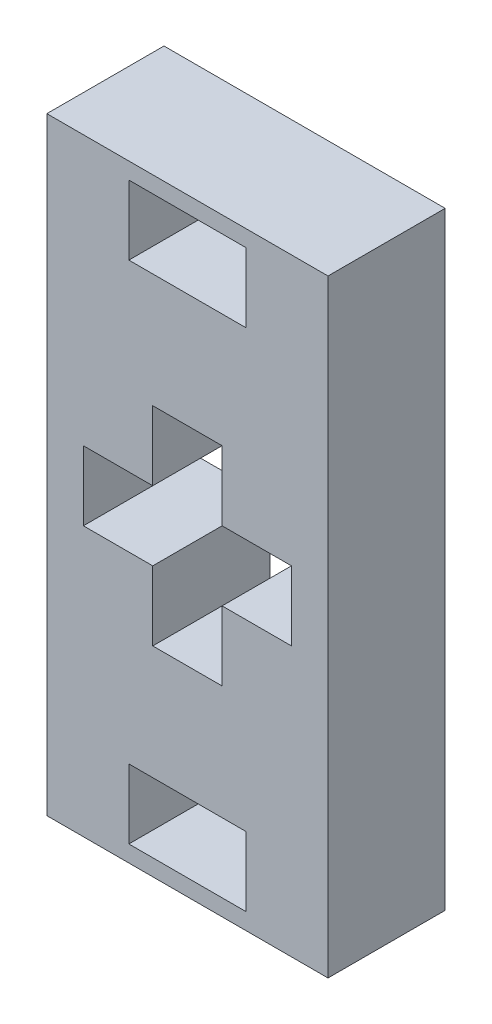
ISO-10303-21;
HEADER;
FILE_DESCRIPTION(('STEP AP214'),'2;1');
FILE_NAME('part.step','',(''),(''),'','','');
FILE_SCHEMA(('AUTOMOTIVE_DESIGN { 1 0 10303 214 1 1 1 1 }'));
ENDSEC;
DATA;
#1=APPLICATION_CONTEXT('core data for automotive mechanical design processes');
#2=APPLICATION_PROTOCOL_DEFINITION('international standard','automotive_design',2000,#1);
#3=PRODUCT_CONTEXT('',#1,'mechanical');
#4=PRODUCT('Part','Part','',(#3));
#5=PRODUCT_RELATED_PRODUCT_CATEGORY('part','',(#4));
#6=PRODUCT_DEFINITION_FORMATION('','',#4);
#7=PRODUCT_DEFINITION_CONTEXT('part definition',#1,'design');
#8=PRODUCT_DEFINITION('design','',#6,#7);
#9=PRODUCT_DEFINITION_SHAPE('','',#8);
#10=(LENGTH_UNIT() NAMED_UNIT(*) SI_UNIT(.MILLI.,.METRE.));
#11=(NAMED_UNIT(*) PLANE_ANGLE_UNIT() SI_UNIT($,.RADIAN.));
#12=(NAMED_UNIT(*) SI_UNIT($,.STERADIAN.) SOLID_ANGLE_UNIT());
#13=UNCERTAINTY_MEASURE_WITH_UNIT(LENGTH_MEASURE(1.E-05),#10,'distance_accuracy_value','');
#14=(GEOMETRIC_REPRESENTATION_CONTEXT(3) GLOBAL_UNCERTAINTY_ASSIGNED_CONTEXT((#13)) GLOBAL_UNIT_ASSIGNED_CONTEXT((#10,
#11,#12)) REPRESENTATION_CONTEXT('',''));
#15=CARTESIAN_POINT('',(0.,0.,0.));
#16=DIRECTION('',(0.,0.,1.));
#17=DIRECTION('',(1.,0.,0.));
#18=AXIS2_PLACEMENT_3D('',#15,#16,#17);
#19=CARTESIAN_POINT('',(0.,16.47698,3.175));
#20=DIRECTION('',(1.,0.,0.));
#21=DIRECTION('',(0.,1.,0.));
#22=AXIS2_PLACEMENT_3D('',#19,#20,#21);
#23=PLANE('',#22);
#24=DIRECTION('',(0.,-1.,0.));
#25=VECTOR('',#24,1.);
#26=CARTESIAN_POINT('',(0.,16.47698,0.));
#27=LINE('',#26,#25);
#28=CARTESIAN_POINT('',(0.,16.47698,0.));
#29=VERTEX_POINT('',#28);
#30=CARTESIAN_POINT('',(0.,0.,0.));
#31=VERTEX_POINT('',#30);
#32=EDGE_CURVE('E341',#29,#31,#27,.T.);
#33=ORIENTED_EDGE('',*,*,#32,.T.);
#34=DIRECTION('',(0.,0.,-1.));
#35=VECTOR('',#34,1.);
#36=CARTESIAN_POINT('',(0.,0.,3.175));
#37=LINE('',#36,#35);
#38=CARTESIAN_POINT('',(0.,0.,3.175));
#39=VERTEX_POINT('',#38);
#40=EDGE_CURVE('E11',#39,#31,#37,.T.);
#41=ORIENTED_EDGE('',*,*,#40,.F.);
#42=DIRECTION('',(0.,-1.,0.));
#43=VECTOR('',#42,1.);
#44=CARTESIAN_POINT('',(0.,16.47698,3.175));
#45=LINE('',#44,#43);
#46=CARTESIAN_POINT('',(0.,16.47698,3.175));
#47=VERTEX_POINT('',#46);
#48=EDGE_CURVE('E342',#47,#39,#45,.T.);
#49=ORIENTED_EDGE('',*,*,#48,.F.);
#50=DIRECTION('',(0.,0.,-1.));
#51=VECTOR('',#50,1.);
#52=CARTESIAN_POINT('',(0.,16.47698,3.175));
#53=LINE('',#52,#51);
#54=EDGE_CURVE('E352',#47,#29,#53,.T.);
#55=ORIENTED_EDGE('',*,*,#54,.T.);
#56=EDGE_LOOP('',(#33,#41,#49,#55));
#57=FACE_BOUND('',#56,.T.);
#58=ADVANCED_FACE('F34',(#57),#23,.F.);
#59=CARTESIAN_POINT('',(0.,0.,3.175));
#60=DIRECTION('',(0.,1.,0.));
#61=DIRECTION('',(-1.,0.,0.));
#62=AXIS2_PLACEMENT_3D('',#59,#60,#61);
#63=PLANE('',#62);
#64=DIRECTION('',(1.,0.,0.));
#65=VECTOR('',#64,1.);
#66=CARTESIAN_POINT('',(0.,0.,0.));
#67=LINE('',#66,#65);
#68=CARTESIAN_POINT('',(7.62,0.,0.));
#69=VERTEX_POINT('',#68);
#70=EDGE_CURVE('E356',#31,#69,#67,.T.);
#71=ORIENTED_EDGE('',*,*,#70,.T.);
#72=DIRECTION('',(0.,0.,-1.));
#73=VECTOR('',#72,1.);
#74=CARTESIAN_POINT('',(7.62,0.,3.175));
#75=LINE('',#74,#73);
#76=CARTESIAN_POINT('',(7.62,0.,3.175));
#77=VERTEX_POINT('',#76);
#78=EDGE_CURVE('E41',#77,#69,#75,.T.);
#79=ORIENTED_EDGE('',*,*,#78,.F.);
#80=DIRECTION('',(1.,0.,0.));
#81=VECTOR('',#80,1.);
#82=CARTESIAN_POINT('',(0.,0.,3.175));
#83=LINE('',#82,#81);
#84=EDGE_CURVE('E345',#39,#77,#83,.T.);
#85=ORIENTED_EDGE('',*,*,#84,.F.);
#86=ORIENTED_EDGE('',*,*,#40,.T.);
#87=EDGE_LOOP('',(#71,#79,#85,#86));
#88=FACE_BOUND('',#87,.T.);
#89=ADVANCED_FACE('F385',(#88),#63,.F.);
#90=CARTESIAN_POINT('',(7.62,16.47698,3.175));
#91=DIRECTION('',(-1.,0.,0.));
#92=DIRECTION('',(0.,-1.,0.));
#93=AXIS2_PLACEMENT_3D('',#90,#91,#92);
#94=PLANE('',#93);
#95=DIRECTION('',(0.,1.,0.));
#96=VECTOR('',#95,1.);
#97=CARTESIAN_POINT('',(7.62,16.47698,0.));
#98=LINE('',#97,#96);
#99=CARTESIAN_POINT('',(7.62,16.47698,0.));
#100=VERTEX_POINT('',#99);
#101=EDGE_CURVE('E358',#69,#100,#98,.T.);
#102=ORIENTED_EDGE('',*,*,#101,.T.);
#103=DIRECTION('',(0.,0.,-1.));
#104=VECTOR('',#103,1.);
#105=CARTESIAN_POINT('',(7.62,16.47698,3.175));
#106=LINE('',#105,#104);
#107=CARTESIAN_POINT('',(7.62,16.47698,3.175));
#108=VERTEX_POINT('',#107);
#109=EDGE_CURVE('E363',#108,#100,#106,.T.);
#110=ORIENTED_EDGE('',*,*,#109,.F.);
#111=DIRECTION('',(0.,1.,0.));
#112=VECTOR('',#111,1.);
#113=CARTESIAN_POINT('',(7.62,16.47698,3.175));
#114=LINE('',#113,#112);
#115=EDGE_CURVE('E348',#77,#108,#114,.T.);
#116=ORIENTED_EDGE('',*,*,#115,.F.);
#117=ORIENTED_EDGE('',*,*,#78,.T.);
#118=EDGE_LOOP('',(#102,#110,#116,#117));
#119=FACE_BOUND('',#118,.T.);
#120=ADVANCED_FACE('F370',(#119),#94,.F.);
#121=CARTESIAN_POINT('',(0.,16.47698,3.175));
#122=DIRECTION('',(0.,-1.,0.));
#123=DIRECTION('',(1.,0.,0.));
#124=AXIS2_PLACEMENT_3D('',#121,#122,#123);
#125=PLANE('',#124);
#126=DIRECTION('',(-1.,0.,0.));
#127=VECTOR('',#126,1.);
#128=CARTESIAN_POINT('',(0.,16.47698,0.));
#129=LINE('',#128,#127);
#130=EDGE_CURVE('E346',#100,#29,#129,.T.);
#131=ORIENTED_EDGE('',*,*,#130,.T.);
#132=ORIENTED_EDGE('',*,*,#54,.F.);
#133=DIRECTION('',(-1.,0.,0.));
#134=VECTOR('',#133,1.);
#135=CARTESIAN_POINT('',(0.,16.47698,3.175));
#136=LINE('',#135,#134);
#137=EDGE_CURVE('E350',#108,#47,#136,.T.);
#138=ORIENTED_EDGE('',*,*,#137,.F.);
#139=ORIENTED_EDGE('',*,*,#109,.T.);
#140=EDGE_LOOP('',(#131,#132,#138,#139));
#141=FACE_BOUND('',#140,.T.);
#142=ADVANCED_FACE('F379',(#141),#125,.F.);
#143=CARTESIAN_POINT('',(0.,0.,3.175));
#144=DIRECTION('',(0.,0.,1.));
#145=DIRECTION('',(1.,0.,0.));
#146=AXIS2_PLACEMENT_3D('',#143,#144,#145);
#147=PLANE('',#146);
#148=DIRECTION('',(-1.,0.,0.));
#149=VECTOR('',#148,1.);
#150=CARTESIAN_POINT('',(2.2225,16.0300688226069,3.175));
#151=LINE('',#150,#149);
#152=CARTESIAN_POINT('',(5.3975,16.0300688226069,3.175));
#153=VERTEX_POINT('',#152);
#154=CARTESIAN_POINT('',(2.2225,16.0300688226069,3.175));
#155=VERTEX_POINT('',#154);
#156=EDGE_CURVE('E48',#153,#155,#151,.T.);
#157=ORIENTED_EDGE('',*,*,#156,.F.);
#158=DIRECTION('',(0.,1.,0.));
#159=VECTOR('',#158,1.);
#160=CARTESIAN_POINT('',(5.3975,16.0300688226069,3.175));
#161=LINE('',#160,#159);
#162=CARTESIAN_POINT('',(5.3975,14.1504688226069,3.175));
#163=VERTEX_POINT('',#162);
#164=EDGE_CURVE('E213',#163,#153,#161,.T.);
#165=ORIENTED_EDGE('',*,*,#164,.F.);
#166=DIRECTION('',(1.,0.,0.));
#167=VECTOR('',#166,1.);
#168=CARTESIAN_POINT('',(2.2225,14.1504688226069,3.175));
#169=LINE('',#168,#167);
#170=CARTESIAN_POINT('',(2.2225,14.1504688226069,3.175));
#171=VERTEX_POINT('',#170);
#172=EDGE_CURVE('E197',#171,#163,#169,.T.);
#173=ORIENTED_EDGE('',*,*,#172,.F.);
#174=DIRECTION('',(0.,-1.,0.));
#175=VECTOR('',#174,1.);
#176=CARTESIAN_POINT('',(2.2225,16.0300688226069,3.175));
#177=LINE('',#176,#175);
#178=EDGE_CURVE('E206',#155,#171,#177,.T.);
#179=ORIENTED_EDGE('',*,*,#178,.F.);
#180=EDGE_LOOP('',(#157,#165,#173,#179));
#181=FACE_BOUND('',#180,.T.);
#182=DIRECTION('',(-1.,0.,0.));
#183=VECTOR('',#182,1.);
#184=CARTESIAN_POINT('',(2.2225,2.32676882260687,3.175));
#185=LINE('',#184,#183);
#186=CARTESIAN_POINT('',(5.3975,2.32676882260687,3.175));
#187=VERTEX_POINT('',#186);
#188=CARTESIAN_POINT('',(2.2225,2.32676882260687,3.175));
#189=VERTEX_POINT('',#188);
#190=EDGE_CURVE('E224',#187,#189,#185,.T.);
#191=ORIENTED_EDGE('',*,*,#190,.F.);
#192=DIRECTION('',(0.,1.,0.));
#193=VECTOR('',#192,1.);
#194=CARTESIAN_POINT('',(5.3975,2.32676882260687,3.175));
#195=LINE('',#194,#193);
#196=CARTESIAN_POINT('',(5.3975,0.44716882260687,3.175));
#197=VERTEX_POINT('',#196);
#198=EDGE_CURVE('E242',#197,#187,#195,.T.);
#199=ORIENTED_EDGE('',*,*,#198,.F.);
#200=DIRECTION('',(1.,0.,0.));
#201=VECTOR('',#200,1.);
#202=CARTESIAN_POINT('',(2.2225,0.447168822606869,3.175));
#203=LINE('',#202,#201);
#204=CARTESIAN_POINT('',(2.2225,0.447168822606869,3.175));
#205=VERTEX_POINT('',#204);
#206=EDGE_CURVE('E239',#205,#197,#203,.T.);
#207=ORIENTED_EDGE('',*,*,#206,.F.);
#208=DIRECTION('',(0.,-1.,0.));
#209=VECTOR('',#208,1.);
#210=CARTESIAN_POINT('',(2.2225,2.32676882260687,3.175));
#211=LINE('',#210,#209);
#212=EDGE_CURVE('E236',#189,#205,#211,.T.);
#213=ORIENTED_EDGE('',*,*,#212,.F.);
#214=EDGE_LOOP('',(#191,#199,#207,#213));
#215=FACE_BOUND('',#214,.T.);
#216=DIRECTION('',(0.,1.,0.));
#217=VECTOR('',#216,1.);
#218=CARTESIAN_POINT('',(4.7498,11.05789,3.175));
#219=LINE('',#218,#217);
#220=CARTESIAN_POINT('',(4.7498,9.17829,3.175));
#221=VERTEX_POINT('',#220);
#222=CARTESIAN_POINT('',(4.7498,11.05789,3.175));
#223=VERTEX_POINT('',#222);
#224=EDGE_CURVE('E254',#221,#223,#219,.T.);
#225=ORIENTED_EDGE('',*,*,#224,.F.);
#226=DIRECTION('',(-1.,0.,0.));
#227=VECTOR('',#226,1.);
#228=CARTESIAN_POINT('',(4.7498,9.17829,3.175));
#229=LINE('',#228,#227);
#230=CARTESIAN_POINT('',(6.6294,9.17829,3.175));
#231=VERTEX_POINT('',#230);
#232=EDGE_CURVE('E313',#231,#221,#229,.T.);
#233=ORIENTED_EDGE('',*,*,#232,.F.);
#234=DIRECTION('',(0.,1.,0.));
#235=VECTOR('',#234,1.);
#236=CARTESIAN_POINT('',(6.6294,9.17829,3.175));
#237=LINE('',#236,#235);
#238=CARTESIAN_POINT('',(6.6294,7.29869,3.175));
#239=VERTEX_POINT('',#238);
#240=EDGE_CURVE('E310',#239,#231,#237,.T.);
#241=ORIENTED_EDGE('',*,*,#240,.F.);
#242=DIRECTION('',(1.,0.,0.));
#243=VECTOR('',#242,1.);
#244=CARTESIAN_POINT('',(6.6294,7.29869,3.175));
#245=LINE('',#244,#243);
#246=CARTESIAN_POINT('',(4.7498,7.29869,3.175));
#247=VERTEX_POINT('',#246);
#248=EDGE_CURVE('E307',#247,#239,#245,.T.);
#249=ORIENTED_EDGE('',*,*,#248,.F.);
#250=DIRECTION('',(0.,1.,0.));
#251=VECTOR('',#250,1.);
#252=CARTESIAN_POINT('',(4.7498,7.29869,3.175));
#253=LINE('',#252,#251);
#254=CARTESIAN_POINT('',(4.7498,5.41909,3.175));
#255=VERTEX_POINT('',#254);
#256=EDGE_CURVE('E304',#255,#247,#253,.T.);
#257=ORIENTED_EDGE('',*,*,#256,.F.);
#258=DIRECTION('',(1.,0.,0.));
#259=VECTOR('',#258,1.);
#260=CARTESIAN_POINT('',(4.7498,5.41909,3.175));
#261=LINE('',#260,#259);
#262=CARTESIAN_POINT('',(2.8702,5.41909,3.175));
#263=VERTEX_POINT('',#262);
#264=EDGE_CURVE('E301',#263,#255,#261,.T.);
#265=ORIENTED_EDGE('',*,*,#264,.F.);
#266=DIRECTION('',(0.,-1.,0.));
#267=VECTOR('',#266,1.);
#268=CARTESIAN_POINT('',(2.8702,5.41909,3.175));
#269=LINE('',#268,#267);
#270=CARTESIAN_POINT('',(2.8702,7.29869,3.175));
#271=VERTEX_POINT('',#270);
#272=EDGE_CURVE('E298',#271,#263,#269,.T.);
#273=ORIENTED_EDGE('',*,*,#272,.F.);
#274=DIRECTION('',(1.,0.,0.));
#275=VECTOR('',#274,1.);
#276=CARTESIAN_POINT('',(0.990600000000005,7.29869,3.175));
#277=LINE('',#276,#275);
#278=CARTESIAN_POINT('',(0.990600000000005,7.29869,3.175));
#279=VERTEX_POINT('',#278);
#280=EDGE_CURVE('E295',#279,#271,#277,.T.);
#281=ORIENTED_EDGE('',*,*,#280,.F.);
#282=DIRECTION('',(0.,-1.,0.));
#283=VECTOR('',#282,1.);
#284=CARTESIAN_POINT('',(0.990600000000005,7.29869,3.175));
#285=LINE('',#284,#283);
#286=CARTESIAN_POINT('',(0.990600000000005,9.17829,3.175));
#287=VERTEX_POINT('',#286);
#288=EDGE_CURVE('E292',#287,#279,#285,.T.);
#289=ORIENTED_EDGE('',*,*,#288,.F.);
#290=DIRECTION('',(-1.,0.,0.));
#291=VECTOR('',#290,1.);
#292=CARTESIAN_POINT('',(2.8702,9.17829,3.175));
#293=LINE('',#292,#291);
#294=CARTESIAN_POINT('',(2.8702,9.17829,3.175));
#295=VERTEX_POINT('',#294);
#296=EDGE_CURVE('E289',#295,#287,#293,.T.);
#297=ORIENTED_EDGE('',*,*,#296,.F.);
#298=DIRECTION('',(0.,-1.,0.));
#299=VECTOR('',#298,1.);
#300=CARTESIAN_POINT('',(2.8702,9.17829,3.175));
#301=LINE('',#300,#299);
#302=CARTESIAN_POINT('',(2.8702,11.05789,3.175));
#303=VERTEX_POINT('',#302);
#304=EDGE_CURVE('E286',#303,#295,#301,.T.);
#305=ORIENTED_EDGE('',*,*,#304,.F.);
#306=DIRECTION('',(-1.,0.,0.));
#307=VECTOR('',#306,1.);
#308=CARTESIAN_POINT('',(2.8702,11.05789,3.175));
#309=LINE('',#308,#307);
#310=EDGE_CURVE('E283',#223,#303,#309,.T.);
#311=ORIENTED_EDGE('',*,*,#310,.F.);
#312=EDGE_LOOP('',(#225,#233,#241,#249,#257,#265,#273,#281,#289,#297,#305,#311));
#313=FACE_BOUND('',#312,.T.);
#314=ORIENTED_EDGE('',*,*,#48,.T.);
#315=ORIENTED_EDGE('',*,*,#84,.T.);
#316=ORIENTED_EDGE('',*,*,#115,.T.);
#317=ORIENTED_EDGE('',*,*,#137,.T.);
#318=EDGE_LOOP('',(#314,#315,#316,#317));
#319=FACE_BOUND('',#318,.T.);
#320=ADVANCED_FACE('F210',(#181,#215,#313,#319),#147,.T.);
#321=CARTESIAN_POINT('',(0.,0.,0.));
#322=DIRECTION('',(0.,0.,1.));
#323=DIRECTION('',(1.,0.,0.));
#324=AXIS2_PLACEMENT_3D('',#321,#322,#323);
#325=PLANE('',#324);
#326=DIRECTION('',(0.,-1.,0.));
#327=VECTOR('',#326,1.);
#328=CARTESIAN_POINT('',(5.3975,16.0300688226069,0.));
#329=LINE('',#328,#327);
#330=CARTESIAN_POINT('',(5.3975,16.0300688226069,0.));
#331=VERTEX_POINT('',#330);
#332=CARTESIAN_POINT('',(5.3975,14.1504688226069,0.));
#333=VERTEX_POINT('',#332);
#334=EDGE_CURVE('E478',#331,#333,#329,.T.);
#335=ORIENTED_EDGE('',*,*,#334,.F.);
#336=DIRECTION('',(1.,0.,0.));
#337=VECTOR('',#336,1.);
#338=CARTESIAN_POINT('',(2.2225,16.0300688226069,0.));
#339=LINE('',#338,#337);
#340=CARTESIAN_POINT('',(2.2225,16.0300688226069,0.));
#341=VERTEX_POINT('',#340);
#342=EDGE_CURVE('E225',#341,#331,#339,.T.);
#343=ORIENTED_EDGE('',*,*,#342,.F.);
#344=DIRECTION('',(0.,1.,0.));
#345=VECTOR('',#344,1.);
#346=CARTESIAN_POINT('',(2.2225,16.0300688226069,0.));
#347=LINE('',#346,#345);
#348=CARTESIAN_POINT('',(2.2225,14.1504688226069,0.));
#349=VERTEX_POINT('',#348);
#350=EDGE_CURVE('E222',#349,#341,#347,.T.);
#351=ORIENTED_EDGE('',*,*,#350,.F.);
#352=DIRECTION('',(-1.,0.,0.));
#353=VECTOR('',#352,1.);
#354=CARTESIAN_POINT('',(2.2225,14.1504688226069,0.));
#355=LINE('',#354,#353);
#356=EDGE_CURVE('E200',#333,#349,#355,.T.);
#357=ORIENTED_EDGE('',*,*,#356,.F.);
#358=EDGE_LOOP('',(#335,#343,#351,#357));
#359=FACE_BOUND('',#358,.T.);
#360=DIRECTION('',(0.,-1.,0.));
#361=VECTOR('',#360,1.);
#362=CARTESIAN_POINT('',(5.3975,2.32676882260687,0.));
#363=LINE('',#362,#361);
#364=CARTESIAN_POINT('',(5.3975,2.32676882260687,0.));
#365=VERTEX_POINT('',#364);
#366=CARTESIAN_POINT('',(5.3975,0.44716882260687,0.));
#367=VERTEX_POINT('',#366);
#368=EDGE_CURVE('E229',#365,#367,#363,.T.);
#369=ORIENTED_EDGE('',*,*,#368,.F.);
#370=DIRECTION('',(1.,0.,0.));
#371=VECTOR('',#370,1.);
#372=CARTESIAN_POINT('',(2.2225,2.32676882260687,0.));
#373=LINE('',#372,#371);
#374=CARTESIAN_POINT('',(2.2225,2.32676882260687,0.));
#375=VERTEX_POINT('',#374);
#376=EDGE_CURVE('E232',#375,#365,#373,.T.);
#377=ORIENTED_EDGE('',*,*,#376,.F.);
#378=DIRECTION('',(0.,1.,0.));
#379=VECTOR('',#378,1.);
#380=CARTESIAN_POINT('',(2.2225,2.32676882260687,0.));
#381=LINE('',#380,#379);
#382=CARTESIAN_POINT('',(2.2225,0.447168822606869,0.));
#383=VERTEX_POINT('',#382);
#384=EDGE_CURVE('E234',#383,#375,#381,.T.);
#385=ORIENTED_EDGE('',*,*,#384,.F.);
#386=DIRECTION('',(-1.,0.,0.));
#387=VECTOR('',#386,1.);
#388=CARTESIAN_POINT('',(2.2225,0.447168822606869,0.));
#389=LINE('',#388,#387);
#390=EDGE_CURVE('E226',#367,#383,#389,.T.);
#391=ORIENTED_EDGE('',*,*,#390,.F.);
#392=EDGE_LOOP('',(#369,#377,#385,#391));
#393=FACE_BOUND('',#392,.T.);
#394=DIRECTION('',(1.,0.,0.));
#395=VECTOR('',#394,1.);
#396=CARTESIAN_POINT('',(4.7498,9.17829,0.));
#397=LINE('',#396,#395);
#398=CARTESIAN_POINT('',(4.7498,9.17829,0.));
#399=VERTEX_POINT('',#398);
#400=CARTESIAN_POINT('',(6.6294,9.17829,0.));
#401=VERTEX_POINT('',#400);
#402=EDGE_CURVE('E276',#399,#401,#397,.T.);
#403=ORIENTED_EDGE('',*,*,#402,.F.);
#404=DIRECTION('',(0.,-1.,0.));
#405=VECTOR('',#404,1.);
#406=CARTESIAN_POINT('',(4.7498,11.05789,0.));
#407=LINE('',#406,#405);
#408=CARTESIAN_POINT('',(4.7498,11.05789,0.));
#409=VERTEX_POINT('',#408);
#410=EDGE_CURVE('E278',#409,#399,#407,.T.);
#411=ORIENTED_EDGE('',*,*,#410,.F.);
#412=DIRECTION('',(1.,0.,0.));
#413=VECTOR('',#412,1.);
#414=CARTESIAN_POINT('',(2.8702,11.05789,0.));
#415=LINE('',#414,#413);
#416=CARTESIAN_POINT('',(2.8702,11.05789,0.));
#417=VERTEX_POINT('',#416);
#418=EDGE_CURVE('E281',#417,#409,#415,.T.);
#419=ORIENTED_EDGE('',*,*,#418,.F.);
#420=DIRECTION('',(0.,1.,0.));
#421=VECTOR('',#420,1.);
#422=CARTESIAN_POINT('',(2.8702,9.17829,0.));
#423=LINE('',#422,#421);
#424=CARTESIAN_POINT('',(2.8702,9.17829,0.));
#425=VERTEX_POINT('',#424);
#426=EDGE_CURVE('E255',#425,#417,#423,.T.);
#427=ORIENTED_EDGE('',*,*,#426,.F.);
#428=DIRECTION('',(1.,0.,0.));
#429=VECTOR('',#428,1.);
#430=CARTESIAN_POINT('',(2.8702,9.17829,0.));
#431=LINE('',#430,#429);
#432=CARTESIAN_POINT('',(0.990600000000005,9.17829,0.));
#433=VERTEX_POINT('',#432);
#434=EDGE_CURVE('E259',#433,#425,#431,.T.);
#435=ORIENTED_EDGE('',*,*,#434,.F.);
#436=DIRECTION('',(0.,1.,0.));
#437=VECTOR('',#436,1.);
#438=CARTESIAN_POINT('',(0.990600000000005,7.29869,0.));
#439=LINE('',#438,#437);
#440=CARTESIAN_POINT('',(0.990600000000005,7.29869,0.));
#441=VERTEX_POINT('',#440);
#442=EDGE_CURVE('E262',#441,#433,#439,.T.);
#443=ORIENTED_EDGE('',*,*,#442,.F.);
#444=DIRECTION('',(-1.,0.,0.));
#445=VECTOR('',#444,1.);
#446=CARTESIAN_POINT('',(0.990600000000005,7.29869,0.));
#447=LINE('',#446,#445);
#448=CARTESIAN_POINT('',(2.8702,7.29869,0.));
#449=VERTEX_POINT('',#448);
#450=EDGE_CURVE('E264',#449,#441,#447,.T.);
#451=ORIENTED_EDGE('',*,*,#450,.F.);
#452=DIRECTION('',(0.,1.,0.));
#453=VECTOR('',#452,1.);
#454=CARTESIAN_POINT('',(2.8702,5.41909,0.));
#455=LINE('',#454,#453);
#456=CARTESIAN_POINT('',(2.8702,5.41909,0.));
#457=VERTEX_POINT('',#456);
#458=EDGE_CURVE('E266',#457,#449,#455,.T.);
#459=ORIENTED_EDGE('',*,*,#458,.F.);
#460=DIRECTION('',(-1.,0.,0.));
#461=VECTOR('',#460,1.);
#462=CARTESIAN_POINT('',(4.7498,5.41909,0.));
#463=LINE('',#462,#461);
#464=CARTESIAN_POINT('',(4.7498,5.41909,0.));
#465=VERTEX_POINT('',#464);
#466=EDGE_CURVE('E268',#465,#457,#463,.T.);
#467=ORIENTED_EDGE('',*,*,#466,.F.);
#468=DIRECTION('',(0.,-1.,0.));
#469=VECTOR('',#468,1.);
#470=CARTESIAN_POINT('',(4.7498,7.29869,0.));
#471=LINE('',#470,#469);
#472=CARTESIAN_POINT('',(4.7498,7.29869,0.));
#473=VERTEX_POINT('',#472);
#474=EDGE_CURVE('E270',#473,#465,#471,.T.);
#475=ORIENTED_EDGE('',*,*,#474,.F.);
#476=DIRECTION('',(-1.,0.,0.));
#477=VECTOR('',#476,1.);
#478=CARTESIAN_POINT('',(6.6294,7.29869,0.));
#479=LINE('',#478,#477);
#480=CARTESIAN_POINT('',(6.6294,7.29869,0.));
#481=VERTEX_POINT('',#480);
#482=EDGE_CURVE('E272',#481,#473,#479,.T.);
#483=ORIENTED_EDGE('',*,*,#482,.F.);
#484=DIRECTION('',(0.,-1.,0.));
#485=VECTOR('',#484,1.);
#486=CARTESIAN_POINT('',(6.6294,9.17829,0.));
#487=LINE('',#486,#485);
#488=EDGE_CURVE('E274',#401,#481,#487,.T.);
#489=ORIENTED_EDGE('',*,*,#488,.F.);
#490=EDGE_LOOP('',(#403,#411,#419,#427,#435,#443,#451,#459,#467,#475,#483,#489));
#491=FACE_BOUND('',#490,.T.);
#492=ORIENTED_EDGE('',*,*,#32,.F.);
#493=ORIENTED_EDGE('',*,*,#130,.F.);
#494=ORIENTED_EDGE('',*,*,#101,.F.);
#495=ORIENTED_EDGE('',*,*,#70,.F.);
#496=EDGE_LOOP('',(#492,#493,#494,#495));
#497=FACE_BOUND('',#496,.T.);
#498=ADVANCED_FACE('F376',(#359,#393,#491,#497),#325,.F.);
#499=CARTESIAN_POINT('',(4.7498,11.05789,-7.97446743550941));
#500=DIRECTION('',(1.,0.,0.));
#501=DIRECTION('',(0.,0.,-1.));
#502=AXIS2_PLACEMENT_3D('',#499,#500,#501);
#503=PLANE('',#502);
#504=ORIENTED_EDGE('',*,*,#410,.T.);
#505=DIRECTION('',(0.,0.,1.));
#506=VECTOR('',#505,1.);
#507=CARTESIAN_POINT('',(4.7498,9.17829,-7.97446743550941));
#508=LINE('',#507,#506);
#509=EDGE_CURVE('E260',#399,#221,#508,.T.);
#510=ORIENTED_EDGE('',*,*,#509,.T.);
#511=ORIENTED_EDGE('',*,*,#224,.T.);
#512=DIRECTION('',(0.,0.,1.));
#513=VECTOR('',#512,1.);
#514=CARTESIAN_POINT('',(4.7498,11.05789,-7.97446743550941));
#515=LINE('',#514,#513);
#516=EDGE_CURVE('E316',#409,#223,#515,.T.);
#517=ORIENTED_EDGE('',*,*,#516,.F.);
#518=EDGE_LOOP('',(#504,#510,#511,#517));
#519=FACE_BOUND('',#518,.T.);
#520=ADVANCED_FACE('F397',(#519),#503,.F.);
#521=CARTESIAN_POINT('',(4.7498,9.17829,-7.97446743550941));
#522=DIRECTION('',(0.,1.,0.));
#523=DIRECTION('',(-1.,0.,0.));
#524=AXIS2_PLACEMENT_3D('',#521,#522,#523);
#525=PLANE('',#524);
#526=ORIENTED_EDGE('',*,*,#402,.T.);
#527=DIRECTION('',(0.,0.,1.));
#528=VECTOR('',#527,1.);
#529=CARTESIAN_POINT('',(6.6294,9.17829,-7.97446743550941));
#530=LINE('',#529,#528);
#531=EDGE_CURVE('E318',#401,#231,#530,.T.);
#532=ORIENTED_EDGE('',*,*,#531,.T.);
#533=ORIENTED_EDGE('',*,*,#232,.T.);
#534=ORIENTED_EDGE('',*,*,#509,.F.);
#535=EDGE_LOOP('',(#526,#532,#533,#534));
#536=FACE_BOUND('',#535,.T.);
#537=ADVANCED_FACE('F403',(#536),#525,.F.);
#538=CARTESIAN_POINT('',(6.6294,9.17829,-7.97446743550941));
#539=DIRECTION('',(1.,0.,0.));
#540=DIRECTION('',(0.,0.,-1.));
#541=AXIS2_PLACEMENT_3D('',#538,#539,#540);
#542=PLANE('',#541);
#543=ORIENTED_EDGE('',*,*,#488,.T.);
#544=DIRECTION('',(0.,0.,1.));
#545=VECTOR('',#544,1.);
#546=CARTESIAN_POINT('',(6.6294,7.29869,-7.97446743550941));
#547=LINE('',#546,#545);
#548=EDGE_CURVE('E320',#481,#239,#547,.T.);
#549=ORIENTED_EDGE('',*,*,#548,.T.);
#550=ORIENTED_EDGE('',*,*,#240,.T.);
#551=ORIENTED_EDGE('',*,*,#531,.F.);
#552=EDGE_LOOP('',(#543,#549,#550,#551));
#553=FACE_BOUND('',#552,.T.);
#554=ADVANCED_FACE('F441',(#553),#542,.F.);
#555=CARTESIAN_POINT('',(6.6294,7.29869,-7.97446743550941));
#556=DIRECTION('',(0.,-1.,0.));
#557=DIRECTION('',(1.,0.,0.));
#558=AXIS2_PLACEMENT_3D('',#555,#556,#557);
#559=PLANE('',#558);
#560=ORIENTED_EDGE('',*,*,#482,.T.);
#561=DIRECTION('',(0.,0.,1.));
#562=VECTOR('',#561,1.);
#563=CARTESIAN_POINT('',(4.7498,7.29869,-7.97446743550941));
#564=LINE('',#563,#562);
#565=EDGE_CURVE('E322',#473,#247,#564,.T.);
#566=ORIENTED_EDGE('',*,*,#565,.T.);
#567=ORIENTED_EDGE('',*,*,#248,.T.);
#568=ORIENTED_EDGE('',*,*,#548,.F.);
#569=EDGE_LOOP('',(#560,#566,#567,#568));
#570=FACE_BOUND('',#569,.T.);
#571=ADVANCED_FACE('F437',(#570),#559,.F.);
#572=CARTESIAN_POINT('',(4.7498,7.29869,-7.97446743550941));
#573=DIRECTION('',(1.,0.,0.));
#574=DIRECTION('',(0.,1.,0.));
#575=AXIS2_PLACEMENT_3D('',#572,#573,#574);
#576=PLANE('',#575);
#577=ORIENTED_EDGE('',*,*,#474,.T.);
#578=DIRECTION('',(0.,0.,1.));
#579=VECTOR('',#578,1.);
#580=CARTESIAN_POINT('',(4.7498,5.41909,-7.97446743550941));
#581=LINE('',#580,#579);
#582=EDGE_CURVE('E324',#465,#255,#581,.T.);
#583=ORIENTED_EDGE('',*,*,#582,.T.);
#584=ORIENTED_EDGE('',*,*,#256,.T.);
#585=ORIENTED_EDGE('',*,*,#565,.F.);
#586=EDGE_LOOP('',(#577,#583,#584,#585));
#587=FACE_BOUND('',#586,.T.);
#588=ADVANCED_FACE('F433',(#587),#576,.F.);
#589=CARTESIAN_POINT('',(4.7498,5.41909,-7.97446743550941));
#590=DIRECTION('',(0.,-1.,0.));
#591=DIRECTION('',(1.,0.,0.));
#592=AXIS2_PLACEMENT_3D('',#589,#590,#591);
#593=PLANE('',#592);
#594=ORIENTED_EDGE('',*,*,#466,.T.);
#595=DIRECTION('',(0.,0.,1.));
#596=VECTOR('',#595,1.);
#597=CARTESIAN_POINT('',(2.8702,5.41909,-7.97446743550941));
#598=LINE('',#597,#596);
#599=EDGE_CURVE('E326',#457,#263,#598,.T.);
#600=ORIENTED_EDGE('',*,*,#599,.T.);
#601=ORIENTED_EDGE('',*,*,#264,.T.);
#602=ORIENTED_EDGE('',*,*,#582,.F.);
#603=EDGE_LOOP('',(#594,#600,#601,#602));
#604=FACE_BOUND('',#603,.T.);
#605=ADVANCED_FACE('F429',(#604),#593,.F.);
#606=CARTESIAN_POINT('',(2.8702,5.41909,-7.97446743550941));
#607=DIRECTION('',(-1.,0.,0.));
#608=DIRECTION('',(0.,0.,1.));
#609=AXIS2_PLACEMENT_3D('',#606,#607,#608);
#610=PLANE('',#609);
#611=ORIENTED_EDGE('',*,*,#458,.T.);
#612=DIRECTION('',(0.,0.,1.));
#613=VECTOR('',#612,1.);
#614=CARTESIAN_POINT('',(2.8702,7.29869,-7.97446743550941));
#615=LINE('',#614,#613);
#616=EDGE_CURVE('E328',#449,#271,#615,.T.);
#617=ORIENTED_EDGE('',*,*,#616,.T.);
#618=ORIENTED_EDGE('',*,*,#272,.T.);
#619=ORIENTED_EDGE('',*,*,#599,.F.);
#620=EDGE_LOOP('',(#611,#617,#618,#619));
#621=FACE_BOUND('',#620,.T.);
#622=ADVANCED_FACE('F425',(#621),#610,.F.);
#623=CARTESIAN_POINT('',(0.990600000000005,7.29869,-7.97446743550941));
#624=DIRECTION('',(0.,-1.,0.));
#625=DIRECTION('',(0.,0.,-1.));
#626=AXIS2_PLACEMENT_3D('',#623,#624,#625);
#627=PLANE('',#626);
#628=ORIENTED_EDGE('',*,*,#450,.T.);
#629=DIRECTION('',(0.,0.,1.));
#630=VECTOR('',#629,1.);
#631=CARTESIAN_POINT('',(0.990600000000005,7.29869,-7.97446743550941));
#632=LINE('',#631,#630);
#633=EDGE_CURVE('E330',#441,#279,#632,.T.);
#634=ORIENTED_EDGE('',*,*,#633,.T.);
#635=ORIENTED_EDGE('',*,*,#280,.T.);
#636=ORIENTED_EDGE('',*,*,#616,.F.);
#637=EDGE_LOOP('',(#628,#634,#635,#636));
#638=FACE_BOUND('',#637,.T.);
#639=ADVANCED_FACE('F421',(#638),#627,.F.);
#640=CARTESIAN_POINT('',(0.990600000000005,7.29869,-7.97446743550941));
#641=DIRECTION('',(-1.,0.,0.));
#642=DIRECTION('',(0.,0.,1.));
#643=AXIS2_PLACEMENT_3D('',#640,#641,#642);
#644=PLANE('',#643);
#645=ORIENTED_EDGE('',*,*,#442,.T.);
#646=DIRECTION('',(0.,0.,1.));
#647=VECTOR('',#646,1.);
#648=CARTESIAN_POINT('',(0.990600000000005,9.17829,-7.97446743550941));
#649=LINE('',#648,#647);
#650=EDGE_CURVE('E332',#433,#287,#649,.T.);
#651=ORIENTED_EDGE('',*,*,#650,.T.);
#652=ORIENTED_EDGE('',*,*,#288,.T.);
#653=ORIENTED_EDGE('',*,*,#633,.F.);
#654=EDGE_LOOP('',(#645,#651,#652,#653));
#655=FACE_BOUND('',#654,.T.);
#656=ADVANCED_FACE('F417',(#655),#644,.F.);
#657=CARTESIAN_POINT('',(2.8702,9.17829,-7.97446743550941));
#658=DIRECTION('',(0.,1.,0.));
#659=DIRECTION('',(-1.,0.,0.));
#660=AXIS2_PLACEMENT_3D('',#657,#658,#659);
#661=PLANE('',#660);
#662=ORIENTED_EDGE('',*,*,#434,.T.);
#663=DIRECTION('',(0.,0.,1.));
#664=VECTOR('',#663,1.);
#665=CARTESIAN_POINT('',(2.8702,9.17829,-7.97446743550941));
#666=LINE('',#665,#664);
#667=EDGE_CURVE('E334',#425,#295,#666,.T.);
#668=ORIENTED_EDGE('',*,*,#667,.T.);
#669=ORIENTED_EDGE('',*,*,#296,.T.);
#670=ORIENTED_EDGE('',*,*,#650,.F.);
#671=EDGE_LOOP('',(#662,#668,#669,#670));
#672=FACE_BOUND('',#671,.T.);
#673=ADVANCED_FACE('F413',(#672),#661,.F.);
#674=CARTESIAN_POINT('',(2.8702,9.17829,-7.97446743550941));
#675=DIRECTION('',(-1.,0.,0.));
#676=DIRECTION('',(0.,0.,1.));
#677=AXIS2_PLACEMENT_3D('',#674,#675,#676);
#678=PLANE('',#677);
#679=ORIENTED_EDGE('',*,*,#426,.T.);
#680=DIRECTION('',(0.,0.,1.));
#681=VECTOR('',#680,1.);
#682=CARTESIAN_POINT('',(2.8702,11.05789,-7.97446743550941));
#683=LINE('',#682,#681);
#684=EDGE_CURVE('E336',#417,#303,#683,.T.);
#685=ORIENTED_EDGE('',*,*,#684,.T.);
#686=ORIENTED_EDGE('',*,*,#304,.T.);
#687=ORIENTED_EDGE('',*,*,#667,.F.);
#688=EDGE_LOOP('',(#679,#685,#686,#687));
#689=FACE_BOUND('',#688,.T.);
#690=ADVANCED_FACE('F409',(#689),#678,.F.);
#691=CARTESIAN_POINT('',(2.8702,11.05789,-7.97446743550941));
#692=DIRECTION('',(0.,1.,0.));
#693=DIRECTION('',(-1.,0.,0.));
#694=AXIS2_PLACEMENT_3D('',#691,#692,#693);
#695=PLANE('',#694);
#696=ORIENTED_EDGE('',*,*,#418,.T.);
#697=ORIENTED_EDGE('',*,*,#516,.T.);
#698=ORIENTED_EDGE('',*,*,#310,.T.);
#699=ORIENTED_EDGE('',*,*,#684,.F.);
#700=EDGE_LOOP('',(#696,#697,#698,#699));
#701=FACE_BOUND('',#700,.T.);
#702=ADVANCED_FACE('F405',(#701),#695,.F.);
#703=CARTESIAN_POINT('',(2.2225,2.32676882260687,-7.97446743550941));
#704=DIRECTION('',(0.,1.,0.));
#705=DIRECTION('',(-1.,0.,0.));
#706=AXIS2_PLACEMENT_3D('',#703,#704,#705);
#707=PLANE('',#706);
#708=ORIENTED_EDGE('',*,*,#376,.T.);
#709=DIRECTION('',(0.,0.,1.));
#710=VECTOR('',#709,1.);
#711=CARTESIAN_POINT('',(5.3975,2.32676882260687,-7.97446743550941));
#712=LINE('',#711,#710);
#713=EDGE_CURVE('E230',#365,#187,#712,.T.);
#714=ORIENTED_EDGE('',*,*,#713,.T.);
#715=ORIENTED_EDGE('',*,*,#190,.T.);
#716=DIRECTION('',(0.,0.,1.));
#717=VECTOR('',#716,1.);
#718=CARTESIAN_POINT('',(2.2225,2.32676882260687,-7.97446743550941));
#719=LINE('',#718,#717);
#720=EDGE_CURVE('E245',#375,#189,#719,.T.);
#721=ORIENTED_EDGE('',*,*,#720,.F.);
#722=EDGE_LOOP('',(#708,#714,#715,#721));
#723=FACE_BOUND('',#722,.T.);
#724=ADVANCED_FACE('F408',(#723),#707,.F.);
#725=CARTESIAN_POINT('',(5.3975,2.32676882260687,-7.97446743550941));
#726=DIRECTION('',(1.,0.,0.));
#727=DIRECTION('',(0.,0.,-1.));
#728=AXIS2_PLACEMENT_3D('',#725,#726,#727);
#729=PLANE('',#728);
#730=ORIENTED_EDGE('',*,*,#368,.T.);
#731=DIRECTION('',(0.,0.,1.));
#732=VECTOR('',#731,1.);
#733=CARTESIAN_POINT('',(5.3975,0.44716882260687,-7.97446743550941));
#734=LINE('',#733,#732);
#735=EDGE_CURVE('E247',#367,#197,#734,.T.);
#736=ORIENTED_EDGE('',*,*,#735,.T.);
#737=ORIENTED_EDGE('',*,*,#198,.T.);
#738=ORIENTED_EDGE('',*,*,#713,.F.);
#739=EDGE_LOOP('',(#730,#736,#737,#738));
#740=FACE_BOUND('',#739,.T.);
#741=ADVANCED_FACE('F451',(#740),#729,.F.);
#742=CARTESIAN_POINT('',(2.2225,0.447168822606869,-7.97446743550941));
#743=DIRECTION('',(0.,-1.,0.));
#744=DIRECTION('',(1.,0.,0.));
#745=AXIS2_PLACEMENT_3D('',#742,#743,#744);
#746=PLANE('',#745);
#747=ORIENTED_EDGE('',*,*,#390,.T.);
#748=DIRECTION('',(0.,0.,1.));
#749=VECTOR('',#748,1.);
#750=CARTESIAN_POINT('',(2.2225,0.447168822606869,-7.97446743550941));
#751=LINE('',#750,#749);
#752=EDGE_CURVE('E249',#383,#205,#751,.T.);
#753=ORIENTED_EDGE('',*,*,#752,.T.);
#754=ORIENTED_EDGE('',*,*,#206,.T.);
#755=ORIENTED_EDGE('',*,*,#735,.F.);
#756=EDGE_LOOP('',(#747,#753,#754,#755));
#757=FACE_BOUND('',#756,.T.);
#758=ADVANCED_FACE('F457',(#757),#746,.F.);
#759=CARTESIAN_POINT('',(2.2225,2.32676882260687,-7.97446743550941));
#760=DIRECTION('',(-1.,0.,0.));
#761=DIRECTION('',(0.,0.,1.));
#762=AXIS2_PLACEMENT_3D('',#759,#760,#761);
#763=PLANE('',#762);
#764=ORIENTED_EDGE('',*,*,#384,.T.);
#765=ORIENTED_EDGE('',*,*,#720,.T.);
#766=ORIENTED_EDGE('',*,*,#212,.T.);
#767=ORIENTED_EDGE('',*,*,#752,.F.);
#768=EDGE_LOOP('',(#764,#765,#766,#767));
#769=FACE_BOUND('',#768,.T.);
#770=ADVANCED_FACE('F453',(#769),#763,.F.);
#771=CARTESIAN_POINT('',(2.2225,16.0300688226069,-7.97446743550941));
#772=DIRECTION('',(0.,1.,0.));
#773=DIRECTION('',(0.,0.,1.));
#774=AXIS2_PLACEMENT_3D('',#771,#772,#773);
#775=PLANE('',#774);
#776=ORIENTED_EDGE('',*,*,#342,.T.);
#777=DIRECTION('',(0.,0.,1.));
#778=VECTOR('',#777,1.);
#779=CARTESIAN_POINT('',(5.3975,16.0300688226069,-7.97446743550941));
#780=LINE('',#779,#778);
#781=EDGE_CURVE('E218',#331,#153,#780,.T.);
#782=ORIENTED_EDGE('',*,*,#781,.T.);
#783=ORIENTED_EDGE('',*,*,#156,.T.);
#784=DIRECTION('',(0.,0.,1.));
#785=VECTOR('',#784,1.);
#786=CARTESIAN_POINT('',(2.2225,16.0300688226069,-7.97446743550941));
#787=LINE('',#786,#785);
#788=EDGE_CURVE('E203',#341,#155,#787,.T.);
#789=ORIENTED_EDGE('',*,*,#788,.F.);
#790=EDGE_LOOP('',(#776,#782,#783,#789));
#791=FACE_BOUND('',#790,.T.);
#792=ADVANCED_FACE('F456',(#791),#775,.F.);
#793=CARTESIAN_POINT('',(5.3975,16.0300688226069,-7.97446743550941));
#794=DIRECTION('',(1.,0.,0.));
#795=DIRECTION('',(0.,0.,-1.));
#796=AXIS2_PLACEMENT_3D('',#793,#794,#795);
#797=PLANE('',#796);
#798=ORIENTED_EDGE('',*,*,#334,.T.);
#799=DIRECTION('',(0.,0.,1.));
#800=VECTOR('',#799,1.);
#801=CARTESIAN_POINT('',(5.3975,14.1504688226069,-7.97446743550941));
#802=LINE('',#801,#800);
#803=EDGE_CURVE('E202',#333,#163,#802,.T.);
#804=ORIENTED_EDGE('',*,*,#803,.T.);
#805=ORIENTED_EDGE('',*,*,#164,.T.);
#806=ORIENTED_EDGE('',*,*,#781,.F.);
#807=EDGE_LOOP('',(#798,#804,#805,#806));
#808=FACE_BOUND('',#807,.T.);
#809=ADVANCED_FACE('F467',(#808),#797,.F.);
#810=CARTESIAN_POINT('',(2.2225,14.1504688226069,-7.97446743550941));
#811=DIRECTION('',(0.,-1.,0.));
#812=DIRECTION('',(0.,0.,-1.));
#813=AXIS2_PLACEMENT_3D('',#810,#811,#812);
#814=PLANE('',#813);
#815=ORIENTED_EDGE('',*,*,#356,.T.);
#816=DIRECTION('',(0.,0.,1.));
#817=VECTOR('',#816,1.);
#818=CARTESIAN_POINT('',(2.2225,14.1504688226069,-7.97446743550941));
#819=LINE('',#818,#817);
#820=EDGE_CURVE('E56',#349,#171,#819,.T.);
#821=ORIENTED_EDGE('',*,*,#820,.T.);
#822=ORIENTED_EDGE('',*,*,#172,.T.);
#823=ORIENTED_EDGE('',*,*,#803,.F.);
#824=EDGE_LOOP('',(#815,#821,#822,#823));
#825=FACE_BOUND('',#824,.T.);
#826=ADVANCED_FACE('F194',(#825),#814,.F.);
#827=CARTESIAN_POINT('',(2.2225,16.0300688226069,-7.97446743550941));
#828=DIRECTION('',(-1.,0.,0.));
#829=DIRECTION('',(0.,0.,1.));
#830=AXIS2_PLACEMENT_3D('',#827,#828,#829);
#831=PLANE('',#830);
#832=ORIENTED_EDGE('',*,*,#350,.T.);
#833=ORIENTED_EDGE('',*,*,#788,.T.);
#834=ORIENTED_EDGE('',*,*,#178,.T.);
#835=ORIENTED_EDGE('',*,*,#820,.F.);
#836=EDGE_LOOP('',(#832,#833,#834,#835));
#837=FACE_BOUND('',#836,.T.);
#838=ADVANCED_FACE('F207',(#837),#831,.F.);
#839=CLOSED_SHELL('',(#58,#89,#120,#142,#320,#498,#520,#537,#554,#571,#588,#605,#622,#639,#656,
#673,#690,#702,#724,#741,#758,#770,#792,#809,#826,#838));
#840=MANIFOLD_SOLID_BREP('B2',#839);
#841=ADVANCED_BREP_SHAPE_REPRESENTATION('',(#18,#840),#14);
#842=SHAPE_DEFINITION_REPRESENTATION(#9,#841);
ENDSEC;
END-ISO-10303-21;
